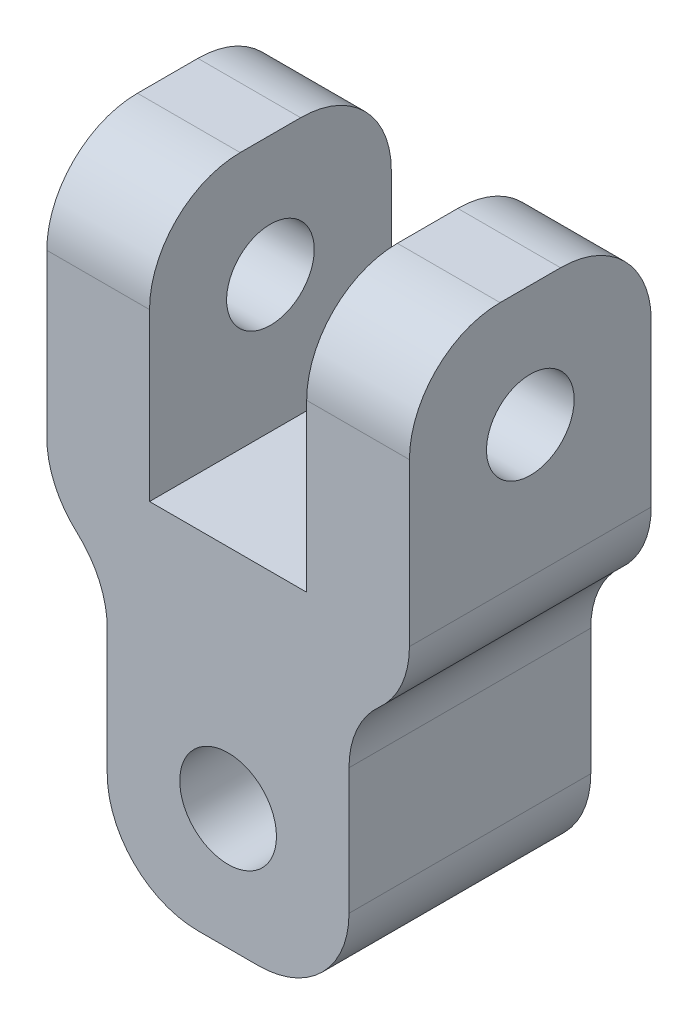
ISO-10303-21;
HEADER;
FILE_DESCRIPTION(('STEP AP214'),'2;1');
FILE_NAME('part.step','',(''),(''),'','','');
FILE_SCHEMA(('AUTOMOTIVE_DESIGN { 1 0 10303 214 1 1 1 1 }'));
ENDSEC;
DATA;
#1=APPLICATION_CONTEXT('core data for automotive mechanical design processes');
#2=APPLICATION_PROTOCOL_DEFINITION('international standard','automotive_design',2000,#1);
#3=PRODUCT_CONTEXT('',#1,'mechanical');
#4=PRODUCT('Part','Part','',(#3));
#5=PRODUCT_RELATED_PRODUCT_CATEGORY('part','',(#4));
#6=PRODUCT_DEFINITION_FORMATION('','',#4);
#7=PRODUCT_DEFINITION_CONTEXT('part definition',#1,'design');
#8=PRODUCT_DEFINITION('design','',#6,#7);
#9=PRODUCT_DEFINITION_SHAPE('','',#8);
#10=(LENGTH_UNIT() NAMED_UNIT(*) SI_UNIT(.MILLI.,.METRE.));
#11=(NAMED_UNIT(*) PLANE_ANGLE_UNIT() SI_UNIT($,.RADIAN.));
#12=(NAMED_UNIT(*) SI_UNIT($,.STERADIAN.) SOLID_ANGLE_UNIT());
#13=UNCERTAINTY_MEASURE_WITH_UNIT(LENGTH_MEASURE(1.E-05),#10,'distance_accuracy_value','');
#14=(GEOMETRIC_REPRESENTATION_CONTEXT(3) GLOBAL_UNCERTAINTY_ASSIGNED_CONTEXT((#13)) GLOBAL_UNIT_ASSIGNED_CONTEXT((#10,
#11,#12)) REPRESENTATION_CONTEXT('',''));
#15=CARTESIAN_POINT('',(0.,0.,0.));
#16=DIRECTION('',(0.,0.,1.));
#17=DIRECTION('',(1.,0.,0.));
#18=AXIS2_PLACEMENT_3D('',#15,#16,#17);
#19=CARTESIAN_POINT('',(0.,20.,0.));
#20=DIRECTION('',(0.,1.,0.));
#21=DIRECTION('',(0.,0.,1.));
#22=AXIS2_PLACEMENT_3D('',#19,#20,#21);
#23=PLANE('',#22);
#24=DIRECTION('',(0.,0.,1.));
#25=VECTOR('',#24,1.);
#26=CARTESIAN_POINT('',(1.4,20.,0.));
#27=LINE('',#26,#25);
#28=CARTESIAN_POINT('',(1.4,20.,3.));
#29=VERTEX_POINT('',#28);
#30=CARTESIAN_POINT('',(1.4,20.,5.));
#31=VERTEX_POINT('',#30);
#32=EDGE_CURVE('E207',#29,#31,#27,.T.);
#33=ORIENTED_EDGE('',*,*,#32,.F.);
#34=DIRECTION('',(-1.,0.,0.));
#35=VECTOR('',#34,1.);
#36=CARTESIAN_POINT('',(-2.,20.,3.));
#37=LINE('',#36,#35);
#38=CARTESIAN_POINT('',(-2.,20.,3.));
#39=VERTEX_POINT('',#38);
#40=EDGE_CURVE('E327',#29,#39,#37,.T.);
#41=ORIENTED_EDGE('',*,*,#40,.T.);
#42=DIRECTION('',(0.,0.,1.));
#43=VECTOR('',#42,1.);
#44=CARTESIAN_POINT('',(-2.,20.,0.));
#45=LINE('',#44,#43);
#46=CARTESIAN_POINT('',(-2.,20.,5.));
#47=VERTEX_POINT('',#46);
#48=EDGE_CURVE('E220',#39,#47,#45,.T.);
#49=ORIENTED_EDGE('',*,*,#48,.T.);
#50=DIRECTION('',(1.,0.,0.));
#51=VECTOR('',#50,1.);
#52=CARTESIAN_POINT('',(1.4,20.,5.));
#53=LINE('',#52,#51);
#54=EDGE_CURVE('E324',#47,#31,#53,.T.);
#55=ORIENTED_EDGE('',*,*,#54,.T.);
#56=EDGE_LOOP('',(#33,#41,#49,#55));
#57=FACE_BOUND('',#56,.T.);
#58=ADVANCED_FACE('F33',(#57),#23,.T.);
#59=CARTESIAN_POINT('',(0.,20.,0.));
#60=DIRECTION('',(1.,0.,0.));
#61=DIRECTION('',(0.,0.,-1.));
#62=AXIS2_PLACEMENT_3D('',#59,#60,#61);
#63=PLANE('',#62);
#64=DIRECTION('',(0.,-1.,0.));
#65=VECTOR('',#64,1.);
#66=CARTESIAN_POINT('',(0.,20.,0.));
#67=LINE('',#66,#65);
#68=CARTESIAN_POINT('',(0.,7.17157287525381,0.));
#69=VERTEX_POINT('',#68);
#70=CARTESIAN_POINT('',(0.,3.,0.));
#71=VERTEX_POINT('',#70);
#72=EDGE_CURVE('E241',#69,#71,#67,.T.);
#73=ORIENTED_EDGE('',*,*,#72,.T.);
#74=DIRECTION('',(0.,0.,1.));
#75=VECTOR('',#74,1.);
#76=CARTESIAN_POINT('',(0.,3.,0.));
#77=LINE('',#76,#75);
#78=CARTESIAN_POINT('',(0.,3.,8.));
#79=VERTEX_POINT('',#78);
#80=EDGE_CURVE('E269',#71,#79,#77,.T.);
#81=ORIENTED_EDGE('',*,*,#80,.T.);
#82=DIRECTION('',(0.,-1.,0.));
#83=VECTOR('',#82,1.);
#84=CARTESIAN_POINT('',(0.,20.,8.));
#85=LINE('',#84,#83);
#86=CARTESIAN_POINT('',(0.,7.17157287525381,8.));
#87=VERTEX_POINT('',#86);
#88=EDGE_CURVE('E250',#87,#79,#85,.T.);
#89=ORIENTED_EDGE('',*,*,#88,.F.);
#90=DIRECTION('',(0.,0.,-1.));
#91=VECTOR('',#90,1.);
#92=CARTESIAN_POINT('',(0.,7.17157287525381,0.));
#93=LINE('',#92,#91);
#94=EDGE_CURVE('E256',#87,#69,#93,.T.);
#95=ORIENTED_EDGE('',*,*,#94,.T.);
#96=EDGE_LOOP('',(#73,#81,#89,#95));
#97=FACE_BOUND('',#96,.T.);
#98=ADVANCED_FACE('F383',(#97),#63,.F.);
#99=CARTESIAN_POINT('',(0.,20.,8.));
#100=DIRECTION('',(0.,0.,-1.));
#101=DIRECTION('',(-1.,0.,0.));
#102=AXIS2_PLACEMENT_3D('',#99,#100,#101);
#103=PLANE('',#102);
#104=CARTESIAN_POINT('',(4.,4.,8.));
#105=DIRECTION('',(0.,0.,1.));
#106=DIRECTION('',(1.,0.,0.));
#107=AXIS2_PLACEMENT_3D('',#104,#105,#106);
#108=CIRCLE('',#107,1.6);
#109=CARTESIAN_POINT('',(5.6,4.,8.));
#110=VERTEX_POINT('',#109);
#111=EDGE_CURVE('E229',#110,#110,#108,.T.);
#112=ORIENTED_EDGE('',*,*,#111,.F.);
#113=EDGE_LOOP('',(#112));
#114=FACE_BOUND('',#113,.T.);
#115=ORIENTED_EDGE('',*,*,#88,.T.);
#116=CARTESIAN_POINT('',(3.,3.,8.));
#117=DIRECTION('',(0.,0.,-1.));
#118=DIRECTION('',(-1.,0.,0.));
#119=AXIS2_PLACEMENT_3D('',#116,#117,#118);
#120=CIRCLE('',#119,3.);
#121=CARTESIAN_POINT('',(3.,0.,8.));
#122=VERTEX_POINT('',#121);
#123=EDGE_CURVE('E286',#79,#122,#120,.F.);
#124=ORIENTED_EDGE('',*,*,#123,.T.);
#125=DIRECTION('',(1.,0.,0.));
#126=VECTOR('',#125,1.);
#127=CARTESIAN_POINT('',(0.,0.,8.));
#128=LINE('',#127,#126);
#129=CARTESIAN_POINT('',(5.,0.,8.));
#130=VERTEX_POINT('',#129);
#131=EDGE_CURVE('E234',#122,#130,#128,.T.);
#132=ORIENTED_EDGE('',*,*,#131,.T.);
#133=CARTESIAN_POINT('',(5.,3.,8.));
#134=DIRECTION('',(0.,0.,-1.));
#135=DIRECTION('',(-1.,0.,0.));
#136=AXIS2_PLACEMENT_3D('',#133,#134,#135);
#137=CIRCLE('',#136,3.);
#138=CARTESIAN_POINT('',(8.,3.,8.));
#139=VERTEX_POINT('',#138);
#140=EDGE_CURVE('E284',#130,#139,#137,.F.);
#141=ORIENTED_EDGE('',*,*,#140,.T.);
#142=DIRECTION('',(0.,-1.,0.));
#143=VECTOR('',#142,1.);
#144=CARTESIAN_POINT('',(8.,20.,8.));
#145=LINE('',#144,#143);
#146=CARTESIAN_POINT('',(8.,7.17157287525381,8.));
#147=VERTEX_POINT('',#146);
#148=EDGE_CURVE('E247',#147,#139,#145,.T.);
#149=ORIENTED_EDGE('',*,*,#148,.F.);
#150=CARTESIAN_POINT('',(11.,7.17157287525381,8.));
#151=DIRECTION('',(0.,0.,-1.));
#152=DIRECTION('',(-1.,0.,0.));
#153=AXIS2_PLACEMENT_3D('',#150,#151,#152);
#154=CIRCLE('',#153,3.);
#155=CARTESIAN_POINT('',(9.,9.4076408527536,8.));
#156=VERTEX_POINT('',#155);
#157=EDGE_CURVE('E259',#147,#156,#154,.T.);
#158=ORIENTED_EDGE('',*,*,#157,.T.);
#159=CARTESIAN_POINT('',(7.,11.6437088302534,8.));
#160=DIRECTION('',(0.,0.,-1.));
#161=DIRECTION('',(-1.,0.,0.));
#162=AXIS2_PLACEMENT_3D('',#159,#160,#161);
#163=CIRCLE('',#162,3.);
#164=CARTESIAN_POINT('',(10.,11.6437088302534,8.));
#165=VERTEX_POINT('',#164);
#166=EDGE_CURVE('E280',#156,#165,#163,.F.);
#167=ORIENTED_EDGE('',*,*,#166,.T.);
#168=DIRECTION('',(0.,1.,0.));
#169=VECTOR('',#168,1.);
#170=CARTESIAN_POINT('',(10.,10.,8.));
#171=LINE('',#170,#169);
#172=CARTESIAN_POINT('',(10.,17.,8.));
#173=VERTEX_POINT('',#172);
#174=EDGE_CURVE('E216',#165,#173,#171,.T.);
#175=ORIENTED_EDGE('',*,*,#174,.T.);
#176=DIRECTION('',(1.,0.,0.));
#177=VECTOR('',#176,1.);
#178=CARTESIAN_POINT('',(6.6,17.,8.));
#179=LINE('',#178,#177);
#180=CARTESIAN_POINT('',(6.6,17.,8.));
#181=VERTEX_POINT('',#180);
#182=EDGE_CURVE('E276',#173,#181,#179,.F.);
#183=ORIENTED_EDGE('',*,*,#182,.T.);
#184=DIRECTION('',(0.,1.,0.));
#185=VECTOR('',#184,1.);
#186=CARTESIAN_POINT('',(6.6,20.,8.));
#187=LINE('',#186,#185);
#188=CARTESIAN_POINT('',(6.6,11.5,8.));
#189=VERTEX_POINT('',#188);
#190=EDGE_CURVE('E183',#189,#181,#187,.T.);
#191=ORIENTED_EDGE('',*,*,#190,.F.);
#192=DIRECTION('',(1.,0.,0.));
#193=VECTOR('',#192,1.);
#194=CARTESIAN_POINT('',(1.4,11.5,8.));
#195=LINE('',#194,#193);
#196=CARTESIAN_POINT('',(1.4,11.5,8.));
#197=VERTEX_POINT('',#196);
#198=EDGE_CURVE('E203',#197,#189,#195,.T.);
#199=ORIENTED_EDGE('',*,*,#198,.F.);
#200=DIRECTION('',(0.,-1.,0.));
#201=VECTOR('',#200,1.);
#202=CARTESIAN_POINT('',(1.4,20.,8.));
#203=LINE('',#202,#201);
#204=CARTESIAN_POINT('',(1.4,17.,8.));
#205=VERTEX_POINT('',#204);
#206=EDGE_CURVE('E189',#205,#197,#203,.T.);
#207=ORIENTED_EDGE('',*,*,#206,.F.);
#208=DIRECTION('',(1.,0.,0.));
#209=VECTOR('',#208,1.);
#210=CARTESIAN_POINT('',(-2.,17.,8.));
#211=LINE('',#210,#209);
#212=CARTESIAN_POINT('',(-2.,17.,8.));
#213=VERTEX_POINT('',#212);
#214=EDGE_CURVE('E278',#205,#213,#211,.F.);
#215=ORIENTED_EDGE('',*,*,#214,.T.);
#216=DIRECTION('',(0.,1.,0.));
#217=VECTOR('',#216,1.);
#218=CARTESIAN_POINT('',(-2.,10.,8.));
#219=LINE('',#218,#217);
#220=CARTESIAN_POINT('',(-2.,11.6437088302534,8.));
#221=VERTEX_POINT('',#220);
#222=EDGE_CURVE('E226',#221,#213,#219,.T.);
#223=ORIENTED_EDGE('',*,*,#222,.F.);
#224=CARTESIAN_POINT('',(1.,11.6437088302534,8.));
#225=DIRECTION('',(0.,0.,-1.));
#226=DIRECTION('',(-1.,0.,0.));
#227=AXIS2_PLACEMENT_3D('',#224,#225,#226);
#228=CIRCLE('',#227,3.);
#229=CARTESIAN_POINT('',(-0.999999999999999,9.4076408527536,8.));
#230=VERTEX_POINT('',#229);
#231=EDGE_CURVE('E282',#221,#230,#228,.F.);
#232=ORIENTED_EDGE('',*,*,#231,.T.);
#233=CARTESIAN_POINT('',(-3.,7.17157287525381,8.));
#234=DIRECTION('',(0.,0.,-1.));
#235=DIRECTION('',(-1.,0.,0.));
#236=AXIS2_PLACEMENT_3D('',#233,#234,#235);
#237=CIRCLE('',#236,3.);
#238=EDGE_CURVE('E267',#230,#87,#237,.T.);
#239=ORIENTED_EDGE('',*,*,#238,.T.);
#240=EDGE_LOOP('',(#115,#124,#132,#141,#149,#158,#167,#175,#183,#191,#199,#207,#215,#223,#232,#239));
#241=FACE_BOUND('',#240,.T.);
#242=ADVANCED_FACE('F353',(#114,#241),#103,.F.);
#243=CARTESIAN_POINT('',(8.,20.,0.));
#244=DIRECTION('',(-1.,0.,0.));
#245=DIRECTION('',(0.,0.,1.));
#246=AXIS2_PLACEMENT_3D('',#243,#244,#245);
#247=PLANE('',#246);
#248=ORIENTED_EDGE('',*,*,#148,.T.);
#249=DIRECTION('',(0.,0.,-1.));
#250=VECTOR('',#249,1.);
#251=CARTESIAN_POINT('',(8.,3.,0.));
#252=LINE('',#251,#250);
#253=CARTESIAN_POINT('',(8.,3.,0.));
#254=VERTEX_POINT('',#253);
#255=EDGE_CURVE('E303',#139,#254,#252,.T.);
#256=ORIENTED_EDGE('',*,*,#255,.T.);
#257=DIRECTION('',(0.,-1.,0.));
#258=VECTOR('',#257,1.);
#259=CARTESIAN_POINT('',(8.,20.,0.));
#260=LINE('',#259,#258);
#261=CARTESIAN_POINT('',(8.,7.17157287525381,0.));
#262=VERTEX_POINT('',#261);
#263=EDGE_CURVE('E244',#262,#254,#260,.T.);
#264=ORIENTED_EDGE('',*,*,#263,.F.);
#265=DIRECTION('',(0.,0.,-1.));
#266=VECTOR('',#265,1.);
#267=CARTESIAN_POINT('',(8.,7.17157287525381,0.));
#268=LINE('',#267,#266);
#269=EDGE_CURVE('E253',#262,#147,#268,.F.);
#270=ORIENTED_EDGE('',*,*,#269,.T.);
#271=EDGE_LOOP('',(#248,#256,#264,#270));
#272=FACE_BOUND('',#271,.T.);
#273=ADVANCED_FACE('F366',(#272),#247,.F.);
#274=CARTESIAN_POINT('',(0.,20.,0.));
#275=DIRECTION('',(0.,0.,1.));
#276=DIRECTION('',(1.,0.,0.));
#277=AXIS2_PLACEMENT_3D('',#274,#275,#276);
#278=PLANE('',#277);
#279=DIRECTION('',(-1.,0.,0.));
#280=VECTOR('',#279,1.);
#281=CARTESIAN_POINT('',(0.,0.,0.));
#282=LINE('',#281,#280);
#283=CARTESIAN_POINT('',(5.,0.,0.));
#284=VERTEX_POINT('',#283);
#285=CARTESIAN_POINT('',(3.,0.,0.));
#286=VERTEX_POINT('',#285);
#287=EDGE_CURVE('E239',#284,#286,#282,.T.);
#288=ORIENTED_EDGE('',*,*,#287,.T.);
#289=CARTESIAN_POINT('',(3.,3.,0.));
#290=DIRECTION('',(0.,0.,1.));
#291=DIRECTION('',(1.,0.,0.));
#292=AXIS2_PLACEMENT_3D('',#289,#290,#291);
#293=CIRCLE('',#292,3.);
#294=EDGE_CURVE('E301',#286,#71,#293,.F.);
#295=ORIENTED_EDGE('',*,*,#294,.T.);
#296=ORIENTED_EDGE('',*,*,#72,.F.);
#297=CARTESIAN_POINT('',(-3.,7.17157287525381,0.));
#298=DIRECTION('',(0.,0.,1.));
#299=DIRECTION('',(1.,0.,0.));
#300=AXIS2_PLACEMENT_3D('',#297,#298,#299);
#301=CIRCLE('',#300,3.);
#302=CARTESIAN_POINT('',(-0.999999999999997,9.4076408527536,0.));
#303=VERTEX_POINT('',#302);
#304=EDGE_CURVE('E264',#69,#303,#301,.T.);
#305=ORIENTED_EDGE('',*,*,#304,.T.);
#306=CARTESIAN_POINT('',(1.,11.6437088302534,0.));
#307=DIRECTION('',(0.,0.,1.));
#308=DIRECTION('',(1.,0.,0.));
#309=AXIS2_PLACEMENT_3D('',#306,#307,#308);
#310=CIRCLE('',#309,3.);
#311=CARTESIAN_POINT('',(-2.,11.6437088302534,0.));
#312=VERTEX_POINT('',#311);
#313=EDGE_CURVE('E297',#303,#312,#310,.F.);
#314=ORIENTED_EDGE('',*,*,#313,.T.);
#315=DIRECTION('',(0.,1.,0.));
#316=VECTOR('',#315,1.);
#317=CARTESIAN_POINT('',(-2.,10.,0.));
#318=LINE('',#317,#316);
#319=CARTESIAN_POINT('',(-2.,17.,0.));
#320=VERTEX_POINT('',#319);
#321=EDGE_CURVE('E225',#312,#320,#318,.T.);
#322=ORIENTED_EDGE('',*,*,#321,.T.);
#323=DIRECTION('',(-1.,0.,0.));
#324=VECTOR('',#323,1.);
#325=CARTESIAN_POINT('',(1.4,17.,0.));
#326=LINE('',#325,#324);
#327=CARTESIAN_POINT('',(1.4,17.,0.));
#328=VERTEX_POINT('',#327);
#329=EDGE_CURVE('E180',#320,#328,#326,.F.);
#330=ORIENTED_EDGE('',*,*,#329,.T.);
#331=DIRECTION('',(0.,-1.,0.));
#332=VECTOR('',#331,1.);
#333=CARTESIAN_POINT('',(1.4,20.,0.));
#334=LINE('',#333,#332);
#335=CARTESIAN_POINT('',(1.4,11.5,0.));
#336=VERTEX_POINT('',#335);
#337=EDGE_CURVE('E170',#328,#336,#334,.T.);
#338=ORIENTED_EDGE('',*,*,#337,.T.);
#339=DIRECTION('',(1.,0.,0.));
#340=VECTOR('',#339,1.);
#341=CARTESIAN_POINT('',(1.4,11.5,0.));
#342=LINE('',#341,#340);
#343=CARTESIAN_POINT('',(6.6,11.5,0.));
#344=VERTEX_POINT('',#343);
#345=EDGE_CURVE('E177',#336,#344,#342,.T.);
#346=ORIENTED_EDGE('',*,*,#345,.T.);
#347=DIRECTION('',(0.,1.,0.));
#348=VECTOR('',#347,1.);
#349=CARTESIAN_POINT('',(6.6,20.,0.));
#350=LINE('',#349,#348);
#351=CARTESIAN_POINT('',(6.6,17.,0.));
#352=VERTEX_POINT('',#351);
#353=EDGE_CURVE('E194',#344,#352,#350,.T.);
#354=ORIENTED_EDGE('',*,*,#353,.T.);
#355=DIRECTION('',(-1.,0.,0.));
#356=VECTOR('',#355,1.);
#357=CARTESIAN_POINT('',(10.,17.,0.));
#358=LINE('',#357,#356);
#359=CARTESIAN_POINT('',(10.,17.,0.));
#360=VERTEX_POINT('',#359);
#361=EDGE_CURVE('E292',#352,#360,#358,.F.);
#362=ORIENTED_EDGE('',*,*,#361,.T.);
#363=DIRECTION('',(0.,1.,0.));
#364=VECTOR('',#363,1.);
#365=CARTESIAN_POINT('',(10.,10.,0.));
#366=LINE('',#365,#364);
#367=CARTESIAN_POINT('',(10.,11.6437088302534,0.));
#368=VERTEX_POINT('',#367);
#369=EDGE_CURVE('E217',#368,#360,#366,.T.);
#370=ORIENTED_EDGE('',*,*,#369,.F.);
#371=CARTESIAN_POINT('',(7.,11.6437088302534,0.));
#372=DIRECTION('',(0.,0.,1.));
#373=DIRECTION('',(1.,0.,0.));
#374=AXIS2_PLACEMENT_3D('',#371,#372,#373);
#375=CIRCLE('',#374,3.);
#376=CARTESIAN_POINT('',(9.,9.4076408527536,0.));
#377=VERTEX_POINT('',#376);
#378=EDGE_CURVE('E295',#368,#377,#375,.F.);
#379=ORIENTED_EDGE('',*,*,#378,.T.);
#380=CARTESIAN_POINT('',(11.,7.17157287525381,0.));
#381=DIRECTION('',(0.,0.,1.));
#382=DIRECTION('',(1.,0.,0.));
#383=AXIS2_PLACEMENT_3D('',#380,#381,#382);
#384=CIRCLE('',#383,3.);
#385=EDGE_CURVE('E262',#377,#262,#384,.T.);
#386=ORIENTED_EDGE('',*,*,#385,.T.);
#387=ORIENTED_EDGE('',*,*,#263,.T.);
#388=CARTESIAN_POINT('',(5.,3.,0.));
#389=DIRECTION('',(0.,0.,1.));
#390=DIRECTION('',(1.,0.,0.));
#391=AXIS2_PLACEMENT_3D('',#388,#389,#390);
#392=CIRCLE('',#391,3.);
#393=EDGE_CURVE('E299',#254,#284,#392,.F.);
#394=ORIENTED_EDGE('',*,*,#393,.T.);
#395=EDGE_LOOP('',(#288,#295,#296,#305,#314,#322,#330,#338,#346,#354,#362,#370,#379,#386,#387,#394));
#396=FACE_BOUND('',#395,.T.);
#397=CARTESIAN_POINT('',(4.,4.,0.));
#398=DIRECTION('',(0.,0.,1.));
#399=DIRECTION('',(1.,0.,0.));
#400=AXIS2_PLACEMENT_3D('',#397,#398,#399);
#401=CIRCLE('',#400,1.6);
#402=CARTESIAN_POINT('',(5.6,4.,0.));
#403=VERTEX_POINT('',#402);
#404=EDGE_CURVE('E231',#403,#403,#401,.T.);
#405=ORIENTED_EDGE('',*,*,#404,.T.);
#406=EDGE_LOOP('',(#405));
#407=FACE_BOUND('',#406,.T.);
#408=ADVANCED_FACE('F173',(#396,#407),#278,.F.);
#409=DIRECTION('',(0.,0.,1.));
#410=VECTOR('',#409,1.);
#411=CARTESIAN_POINT('',(6.6,20.,0.));
#412=LINE('',#411,#410);
#413=CARTESIAN_POINT('',(6.6,20.,3.));
#414=VERTEX_POINT('',#413);
#415=CARTESIAN_POINT('',(6.6,20.,5.));
#416=VERTEX_POINT('',#415);
#417=EDGE_CURVE('E211',#414,#416,#412,.T.);
#418=ORIENTED_EDGE('',*,*,#417,.T.);
#419=DIRECTION('',(1.,0.,0.));
#420=VECTOR('',#419,1.);
#421=CARTESIAN_POINT('',(10.,20.,5.));
#422=LINE('',#421,#420);
#423=CARTESIAN_POINT('',(10.,20.,5.));
#424=VERTEX_POINT('',#423);
#425=EDGE_CURVE('E336',#416,#424,#422,.T.);
#426=ORIENTED_EDGE('',*,*,#425,.T.);
#427=DIRECTION('',(0.,0.,-1.));
#428=VECTOR('',#427,1.);
#429=CARTESIAN_POINT('',(10.,20.,0.));
#430=LINE('',#429,#428);
#431=CARTESIAN_POINT('',(10.,20.,3.));
#432=VERTEX_POINT('',#431);
#433=EDGE_CURVE('E210',#424,#432,#430,.T.);
#434=ORIENTED_EDGE('',*,*,#433,.T.);
#435=DIRECTION('',(-1.,0.,0.));
#436=VECTOR('',#435,1.);
#437=CARTESIAN_POINT('',(6.6,20.,3.));
#438=LINE('',#437,#436);
#439=EDGE_CURVE('E334',#432,#414,#438,.T.);
#440=ORIENTED_EDGE('',*,*,#439,.T.);
#441=EDGE_LOOP('',(#418,#426,#434,#440));
#442=FACE_BOUND('',#441,.T.);
#443=ADVANCED_FACE('F346',(#442),#23,.T.);
#444=CARTESIAN_POINT('',(0.,0.,0.));
#445=DIRECTION('',(0.,1.,0.));
#446=DIRECTION('',(0.,0.,1.));
#447=AXIS2_PLACEMENT_3D('',#444,#445,#446);
#448=PLANE('',#447);
#449=ORIENTED_EDGE('',*,*,#131,.F.);
#450=DIRECTION('',(0.,0.,1.));
#451=VECTOR('',#450,1.);
#452=CARTESIAN_POINT('',(3.,0.,0.));
#453=LINE('',#452,#451);
#454=EDGE_CURVE('E290',#122,#286,#453,.F.);
#455=ORIENTED_EDGE('',*,*,#454,.T.);
#456=ORIENTED_EDGE('',*,*,#287,.F.);
#457=DIRECTION('',(0.,0.,-1.));
#458=VECTOR('',#457,1.);
#459=CARTESIAN_POINT('',(5.,0.,0.));
#460=LINE('',#459,#458);
#461=EDGE_CURVE('E288',#284,#130,#460,.F.);
#462=ORIENTED_EDGE('',*,*,#461,.T.);
#463=EDGE_LOOP('',(#449,#455,#456,#462));
#464=FACE_BOUND('',#463,.T.);
#465=ADVANCED_FACE('F376',(#464),#448,.F.);
#466=CARTESIAN_POINT('',(4.,4.,0.));
#467=DIRECTION('',(0.,0.,1.));
#468=DIRECTION('',(1.,0.,0.));
#469=AXIS2_PLACEMENT_3D('',#466,#467,#468);
#470=CYLINDRICAL_SURFACE('',#469,1.6);
#471=ORIENTED_EDGE('',*,*,#404,.F.);
#472=EDGE_LOOP('',(#471));
#473=FACE_BOUND('',#472,.T.);
#474=ORIENTED_EDGE('',*,*,#111,.T.);
#475=EDGE_LOOP('',(#474));
#476=FACE_BOUND('',#475,.T.);
#477=ADVANCED_FACE('F430',(#473,#476),#470,.F.);
#478=CARTESIAN_POINT('',(-2.,10.,0.));
#479=DIRECTION('',(-1.,0.,0.));
#480=DIRECTION('',(0.,0.,1.));
#481=AXIS2_PLACEMENT_3D('',#478,#479,#480);
#482=PLANE('',#481);
#483=CARTESIAN_POINT('',(-2.,16.,4.));
#484=DIRECTION('',(1.,0.,0.));
#485=DIRECTION('',(0.,0.,-1.));
#486=AXIS2_PLACEMENT_3D('',#483,#484,#485);
#487=CIRCLE('',#486,1.45);
#488=CARTESIAN_POINT('',(-2.,16.,2.55));
#489=VERTEX_POINT('',#488);
#490=EDGE_CURVE('E273',#489,#489,#487,.T.);
#491=ORIENTED_EDGE('',*,*,#490,.T.);
#492=EDGE_LOOP('',(#491));
#493=FACE_BOUND('',#492,.T.);
#494=ORIENTED_EDGE('',*,*,#321,.F.);
#495=DIRECTION('',(0.,0.,1.));
#496=VECTOR('',#495,1.);
#497=CARTESIAN_POINT('',(-2.,11.6437088302534,8.));
#498=LINE('',#497,#496);
#499=EDGE_CURVE('E310',#312,#221,#498,.T.);
#500=ORIENTED_EDGE('',*,*,#499,.T.);
#501=ORIENTED_EDGE('',*,*,#222,.T.);
#502=CARTESIAN_POINT('',(-2.,17.,5.));
#503=DIRECTION('',(-1.,0.,0.));
#504=DIRECTION('',(0.,0.,1.));
#505=AXIS2_PLACEMENT_3D('',#502,#503,#504);
#506=CIRCLE('',#505,3.);
#507=EDGE_CURVE('E306',#213,#47,#506,.T.);
#508=ORIENTED_EDGE('',*,*,#507,.T.);
#509=ORIENTED_EDGE('',*,*,#48,.F.);
#510=CARTESIAN_POINT('',(-2.,17.,3.));
#511=DIRECTION('',(-1.,0.,0.));
#512=DIRECTION('',(0.,0.,1.));
#513=AXIS2_PLACEMENT_3D('',#510,#511,#512);
#514=CIRCLE('',#513,3.);
#515=EDGE_CURVE('E308',#39,#320,#514,.T.);
#516=ORIENTED_EDGE('',*,*,#515,.T.);
#517=EDGE_LOOP('',(#494,#500,#501,#508,#509,#516));
#518=FACE_BOUND('',#517,.T.);
#519=ADVANCED_FACE('F397',(#493,#518),#482,.T.);
#520=CARTESIAN_POINT('',(10.,10.,0.));
#521=DIRECTION('',(1.,0.,0.));
#522=DIRECTION('',(0.,0.,-1.));
#523=AXIS2_PLACEMENT_3D('',#520,#521,#522);
#524=PLANE('',#523);
#525=CARTESIAN_POINT('',(10.,16.,4.));
#526=DIRECTION('',(1.,0.,0.));
#527=DIRECTION('',(0.,0.,-1.));
#528=AXIS2_PLACEMENT_3D('',#525,#526,#527);
#529=CIRCLE('',#528,1.45);
#530=CARTESIAN_POINT('',(10.,16.,2.55));
#531=VERTEX_POINT('',#530);
#532=EDGE_CURVE('E637',#531,#531,#529,.T.);
#533=ORIENTED_EDGE('',*,*,#532,.F.);
#534=EDGE_LOOP('',(#533));
#535=FACE_BOUND('',#534,.T.);
#536=ORIENTED_EDGE('',*,*,#174,.F.);
#537=DIRECTION('',(0.,0.,1.));
#538=VECTOR('',#537,1.);
#539=CARTESIAN_POINT('',(10.,11.6437088302534,0.));
#540=LINE('',#539,#538);
#541=EDGE_CURVE('E319',#165,#368,#540,.F.);
#542=ORIENTED_EDGE('',*,*,#541,.T.);
#543=ORIENTED_EDGE('',*,*,#369,.T.);
#544=CARTESIAN_POINT('',(10.,17.,3.));
#545=DIRECTION('',(1.,0.,0.));
#546=DIRECTION('',(0.,0.,-1.));
#547=AXIS2_PLACEMENT_3D('',#544,#545,#546);
#548=CIRCLE('',#547,3.);
#549=EDGE_CURVE('E315',#360,#432,#548,.T.);
#550=ORIENTED_EDGE('',*,*,#549,.T.);
#551=ORIENTED_EDGE('',*,*,#433,.F.);
#552=CARTESIAN_POINT('',(10.,17.,5.));
#553=DIRECTION('',(1.,0.,0.));
#554=DIRECTION('',(0.,0.,-1.));
#555=AXIS2_PLACEMENT_3D('',#552,#553,#554);
#556=CIRCLE('',#555,3.);
#557=EDGE_CURVE('E317',#424,#173,#556,.T.);
#558=ORIENTED_EDGE('',*,*,#557,.T.);
#559=EDGE_LOOP('',(#536,#542,#543,#550,#551,#558));
#560=FACE_BOUND('',#559,.T.);
#561=ADVANCED_FACE('F344',(#535,#560),#524,.T.);
#562=CARTESIAN_POINT('',(1.4,20.,0.));
#563=DIRECTION('',(-1.,0.,0.));
#564=DIRECTION('',(0.,-1.,0.));
#565=AXIS2_PLACEMENT_3D('',#562,#563,#564);
#566=PLANE('',#565);
#567=CARTESIAN_POINT('',(1.4,16.,4.));
#568=DIRECTION('',(-1.,0.,0.));
#569=DIRECTION('',(0.,-1.,0.));
#570=AXIS2_PLACEMENT_3D('',#567,#568,#569);
#571=CIRCLE('',#570,1.45);
#572=CARTESIAN_POINT('',(1.4,14.55,4.));
#573=VERTEX_POINT('',#572);
#574=EDGE_CURVE('E204',#573,#573,#571,.T.);
#575=ORIENTED_EDGE('',*,*,#574,.T.);
#576=EDGE_LOOP('',(#575));
#577=FACE_BOUND('',#576,.T.);
#578=ORIENTED_EDGE('',*,*,#337,.F.);
#579=CARTESIAN_POINT('',(1.4,17.,3.));
#580=DIRECTION('',(-1.,0.,0.));
#581=DIRECTION('',(0.,-1.,0.));
#582=AXIS2_PLACEMENT_3D('',#579,#580,#581);
#583=CIRCLE('',#582,3.);
#584=EDGE_CURVE('E332',#328,#29,#583,.F.);
#585=ORIENTED_EDGE('',*,*,#584,.T.);
#586=ORIENTED_EDGE('',*,*,#32,.T.);
#587=CARTESIAN_POINT('',(1.4,17.,5.));
#588=DIRECTION('',(-1.,0.,0.));
#589=DIRECTION('',(0.,-1.,0.));
#590=AXIS2_PLACEMENT_3D('',#587,#588,#589);
#591=CIRCLE('',#590,3.);
#592=EDGE_CURVE('E330',#31,#205,#591,.F.);
#593=ORIENTED_EDGE('',*,*,#592,.T.);
#594=ORIENTED_EDGE('',*,*,#206,.T.);
#595=DIRECTION('',(0.,0.,1.));
#596=VECTOR('',#595,1.);
#597=CARTESIAN_POINT('',(1.4,11.5,0.));
#598=LINE('',#597,#596);
#599=EDGE_CURVE('E186',#336,#197,#598,.T.);
#600=ORIENTED_EDGE('',*,*,#599,.F.);
#601=EDGE_LOOP('',(#578,#585,#586,#593,#594,#600));
#602=FACE_BOUND('',#601,.T.);
#603=ADVANCED_FACE('F187',(#577,#602),#566,.F.);
#604=CARTESIAN_POINT('',(6.6,20.,0.));
#605=DIRECTION('',(1.,0.,0.));
#606=DIRECTION('',(0.,1.,0.));
#607=AXIS2_PLACEMENT_3D('',#604,#605,#606);
#608=PLANE('',#607);
#609=CARTESIAN_POINT('',(6.6,16.,4.));
#610=DIRECTION('',(1.,0.,0.));
#611=DIRECTION('',(0.,1.,0.));
#612=AXIS2_PLACEMENT_3D('',#609,#610,#611);
#613=CIRCLE('',#612,1.45);
#614=CARTESIAN_POINT('',(6.6,17.45,4.));
#615=VERTEX_POINT('',#614);
#616=EDGE_CURVE('E270',#615,#615,#613,.T.);
#617=ORIENTED_EDGE('',*,*,#616,.T.);
#618=EDGE_LOOP('',(#617));
#619=FACE_BOUND('',#618,.T.);
#620=ORIENTED_EDGE('',*,*,#190,.T.);
#621=CARTESIAN_POINT('',(6.6,17.,5.));
#622=DIRECTION('',(1.,0.,0.));
#623=DIRECTION('',(0.,1.,0.));
#624=AXIS2_PLACEMENT_3D('',#621,#622,#623);
#625=CIRCLE('',#624,3.);
#626=EDGE_CURVE('E11',#181,#416,#625,.F.);
#627=ORIENTED_EDGE('',*,*,#626,.T.);
#628=ORIENTED_EDGE('',*,*,#417,.F.);
#629=CARTESIAN_POINT('',(6.6,17.,3.));
#630=DIRECTION('',(1.,0.,0.));
#631=DIRECTION('',(0.,1.,0.));
#632=AXIS2_PLACEMENT_3D('',#629,#630,#631);
#633=CIRCLE('',#632,3.);
#634=EDGE_CURVE('E41',#414,#352,#633,.F.);
#635=ORIENTED_EDGE('',*,*,#634,.T.);
#636=ORIENTED_EDGE('',*,*,#353,.F.);
#637=DIRECTION('',(0.,0.,1.));
#638=VECTOR('',#637,1.);
#639=CARTESIAN_POINT('',(6.6,11.5,0.));
#640=LINE('',#639,#638);
#641=EDGE_CURVE('E193',#344,#189,#640,.T.);
#642=ORIENTED_EDGE('',*,*,#641,.T.);
#643=EDGE_LOOP('',(#620,#627,#628,#635,#636,#642));
#644=FACE_BOUND('',#643,.T.);
#645=ADVANCED_FACE('F338',(#619,#644),#608,.F.);
#646=CARTESIAN_POINT('',(1.4,11.5,0.));
#647=DIRECTION('',(0.,-1.,0.));
#648=DIRECTION('',(0.,0.,-1.));
#649=AXIS2_PLACEMENT_3D('',#646,#647,#648);
#650=PLANE('',#649);
#651=ORIENTED_EDGE('',*,*,#198,.T.);
#652=ORIENTED_EDGE('',*,*,#641,.F.);
#653=ORIENTED_EDGE('',*,*,#345,.F.);
#654=ORIENTED_EDGE('',*,*,#599,.T.);
#655=EDGE_LOOP('',(#651,#652,#653,#654));
#656=FACE_BOUND('',#655,.T.);
#657=ADVANCED_FACE('F196',(#656),#650,.F.);
#658=CARTESIAN_POINT('',(11.,7.17157287525381,0.));
#659=DIRECTION('',(0.,0.,-1.));
#660=DIRECTION('',(-1.,0.,0.));
#661=AXIS2_PLACEMENT_3D('',#658,#659,#660);
#662=CYLINDRICAL_SURFACE('',#661,3.);
#663=ORIENTED_EDGE('',*,*,#385,.F.);
#664=DIRECTION('',(0.,0.,-1.));
#665=VECTOR('',#664,1.);
#666=CARTESIAN_POINT('',(9.,9.4076408527536,0.));
#667=LINE('',#666,#665);
#668=EDGE_CURVE('E322',#377,#156,#667,.F.);
#669=ORIENTED_EDGE('',*,*,#668,.T.);
#670=ORIENTED_EDGE('',*,*,#157,.F.);
#671=ORIENTED_EDGE('',*,*,#269,.F.);
#672=EDGE_LOOP('',(#663,#669,#670,#671));
#673=FACE_BOUND('',#672,.T.);
#674=ADVANCED_FACE('F364',(#673),#662,.F.);
#675=CARTESIAN_POINT('',(-3.,7.17157287525381,0.));
#676=DIRECTION('',(0.,0.,-1.));
#677=DIRECTION('',(-1.,0.,0.));
#678=AXIS2_PLACEMENT_3D('',#675,#676,#677);
#679=CYLINDRICAL_SURFACE('',#678,3.);
#680=ORIENTED_EDGE('',*,*,#238,.F.);
#681=DIRECTION('',(0.,0.,-1.));
#682=VECTOR('',#681,1.);
#683=CARTESIAN_POINT('',(-0.999999999999998,9.4076408527536,0.));
#684=LINE('',#683,#682);
#685=EDGE_CURVE('E313',#230,#303,#684,.T.);
#686=ORIENTED_EDGE('',*,*,#685,.T.);
#687=ORIENTED_EDGE('',*,*,#304,.F.);
#688=ORIENTED_EDGE('',*,*,#94,.F.);
#689=EDGE_LOOP('',(#680,#686,#687,#688));
#690=FACE_BOUND('',#689,.T.);
#691=ADVANCED_FACE('F388',(#690),#679,.F.);
#692=CARTESIAN_POINT('',(-2.,16.,4.));
#693=DIRECTION('',(1.,0.,0.));
#694=DIRECTION('',(0.,0.,-1.));
#695=AXIS2_PLACEMENT_3D('',#692,#693,#694);
#696=CYLINDRICAL_SURFACE('',#695,1.45);
#697=ORIENTED_EDGE('',*,*,#532,.T.);
#698=EDGE_LOOP('',(#697));
#699=FACE_BOUND('',#698,.T.);
#700=ORIENTED_EDGE('',*,*,#616,.F.);
#701=EDGE_LOOP('',(#700));
#702=FACE_BOUND('',#701,.T.);
#703=ADVANCED_FACE('F444',(#699,#702),#696,.F.);
#704=ORIENTED_EDGE('',*,*,#490,.F.);
#705=EDGE_LOOP('',(#704));
#706=FACE_BOUND('',#705,.T.);
#707=ORIENTED_EDGE('',*,*,#574,.F.);
#708=EDGE_LOOP('',(#707));
#709=FACE_BOUND('',#708,.T.);
#710=ADVANCED_FACE('F447',(#706,#709),#696,.F.);
#711=CARTESIAN_POINT('',(3.,3.,0.));
#712=DIRECTION('',(0.,0.,1.));
#713=DIRECTION('',(1.,0.,0.));
#714=AXIS2_PLACEMENT_3D('',#711,#712,#713);
#715=CYLINDRICAL_SURFACE('',#714,3.);
#716=ORIENTED_EDGE('',*,*,#294,.F.);
#717=ORIENTED_EDGE('',*,*,#454,.F.);
#718=ORIENTED_EDGE('',*,*,#123,.F.);
#719=ORIENTED_EDGE('',*,*,#80,.F.);
#720=EDGE_LOOP('',(#716,#717,#718,#719));
#721=FACE_BOUND('',#720,.T.);
#722=ADVANCED_FACE('F379',(#721),#715,.T.);
#723=CARTESIAN_POINT('',(5.,3.,0.));
#724=DIRECTION('',(0.,0.,-1.));
#725=DIRECTION('',(-1.,0.,0.));
#726=AXIS2_PLACEMENT_3D('',#723,#724,#725);
#727=CYLINDRICAL_SURFACE('',#726,3.);
#728=ORIENTED_EDGE('',*,*,#140,.F.);
#729=ORIENTED_EDGE('',*,*,#461,.F.);
#730=ORIENTED_EDGE('',*,*,#393,.F.);
#731=ORIENTED_EDGE('',*,*,#255,.F.);
#732=EDGE_LOOP('',(#728,#729,#730,#731));
#733=FACE_BOUND('',#732,.T.);
#734=ADVANCED_FACE('F372',(#733),#727,.T.);
#735=CARTESIAN_POINT('',(1.,11.6437088302534,0.));
#736=DIRECTION('',(0.,0.,-1.));
#737=DIRECTION('',(-1.,0.,0.));
#738=AXIS2_PLACEMENT_3D('',#735,#736,#737);
#739=CYLINDRICAL_SURFACE('',#738,3.);
#740=ORIENTED_EDGE('',*,*,#313,.F.);
#741=ORIENTED_EDGE('',*,*,#685,.F.);
#742=ORIENTED_EDGE('',*,*,#231,.F.);
#743=ORIENTED_EDGE('',*,*,#499,.F.);
#744=EDGE_LOOP('',(#740,#741,#742,#743));
#745=FACE_BOUND('',#744,.T.);
#746=ADVANCED_FACE('F394',(#745),#739,.T.);
#747=CARTESIAN_POINT('',(7.,11.6437088302534,0.));
#748=DIRECTION('',(0.,0.,-1.));
#749=DIRECTION('',(-1.,0.,0.));
#750=AXIS2_PLACEMENT_3D('',#747,#748,#749);
#751=CYLINDRICAL_SURFACE('',#750,3.);
#752=ORIENTED_EDGE('',*,*,#166,.F.);
#753=ORIENTED_EDGE('',*,*,#668,.F.);
#754=ORIENTED_EDGE('',*,*,#378,.F.);
#755=ORIENTED_EDGE('',*,*,#541,.F.);
#756=EDGE_LOOP('',(#752,#753,#754,#755));
#757=FACE_BOUND('',#756,.T.);
#758=ADVANCED_FACE('F359',(#757),#751,.T.);
#759=CARTESIAN_POINT('',(0.,17.,3.));
#760=DIRECTION('',(1.,0.,0.));
#761=DIRECTION('',(0.,0.,-1.));
#762=AXIS2_PLACEMENT_3D('',#759,#760,#761);
#763=CYLINDRICAL_SURFACE('',#762,3.);
#764=ORIENTED_EDGE('',*,*,#584,.F.);
#765=ORIENTED_EDGE('',*,*,#329,.F.);
#766=ORIENTED_EDGE('',*,*,#515,.F.);
#767=ORIENTED_EDGE('',*,*,#40,.F.);
#768=EDGE_LOOP('',(#764,#765,#766,#767));
#769=FACE_BOUND('',#768,.T.);
#770=ADVANCED_FACE('F408',(#769),#763,.T.);
#771=CARTESIAN_POINT('',(0.,17.,5.));
#772=DIRECTION('',(-1.,0.,0.));
#773=DIRECTION('',(0.,0.,1.));
#774=AXIS2_PLACEMENT_3D('',#771,#772,#773);
#775=CYLINDRICAL_SURFACE('',#774,3.);
#776=ORIENTED_EDGE('',*,*,#507,.F.);
#777=ORIENTED_EDGE('',*,*,#214,.F.);
#778=ORIENTED_EDGE('',*,*,#592,.F.);
#779=ORIENTED_EDGE('',*,*,#54,.F.);
#780=EDGE_LOOP('',(#776,#777,#778,#779));
#781=FACE_BOUND('',#780,.T.);
#782=ADVANCED_FACE('F401',(#781),#775,.T.);
#783=CARTESIAN_POINT('',(0.,17.,5.));
#784=DIRECTION('',(-1.,0.,0.));
#785=DIRECTION('',(0.,0.,1.));
#786=AXIS2_PLACEMENT_3D('',#783,#784,#785);
#787=CYLINDRICAL_SURFACE('',#786,3.);
#788=ORIENTED_EDGE('',*,*,#626,.F.);
#789=ORIENTED_EDGE('',*,*,#182,.F.);
#790=ORIENTED_EDGE('',*,*,#557,.F.);
#791=ORIENTED_EDGE('',*,*,#425,.F.);
#792=EDGE_LOOP('',(#788,#789,#790,#791));
#793=FACE_BOUND('',#792,.T.);
#794=ADVANCED_FACE('F349',(#793),#787,.T.);
#795=CARTESIAN_POINT('',(0.,17.,3.));
#796=DIRECTION('',(1.,0.,0.));
#797=DIRECTION('',(0.,0.,-1.));
#798=AXIS2_PLACEMENT_3D('',#795,#796,#797);
#799=CYLINDRICAL_SURFACE('',#798,3.);
#800=ORIENTED_EDGE('',*,*,#549,.F.);
#801=ORIENTED_EDGE('',*,*,#361,.F.);
#802=ORIENTED_EDGE('',*,*,#634,.F.);
#803=ORIENTED_EDGE('',*,*,#439,.F.);
#804=EDGE_LOOP('',(#800,#801,#802,#803));
#805=FACE_BOUND('',#804,.T.);
#806=ADVANCED_FACE('F35',(#805),#799,.T.);
#807=CLOSED_SHELL('',(#58,#98,#242,#273,#408,#443,#465,#477,#519,#561,#603,#645,#657,#674,#691,
#703,#710,#722,#734,#746,#758,#770,#782,#794,#806));
#808=MANIFOLD_SOLID_BREP('B2',#807);
#809=ADVANCED_BREP_SHAPE_REPRESENTATION('',(#18,#808),#14);
#810=SHAPE_DEFINITION_REPRESENTATION(#9,#809);
ENDSEC;
END-ISO-10303-21;
